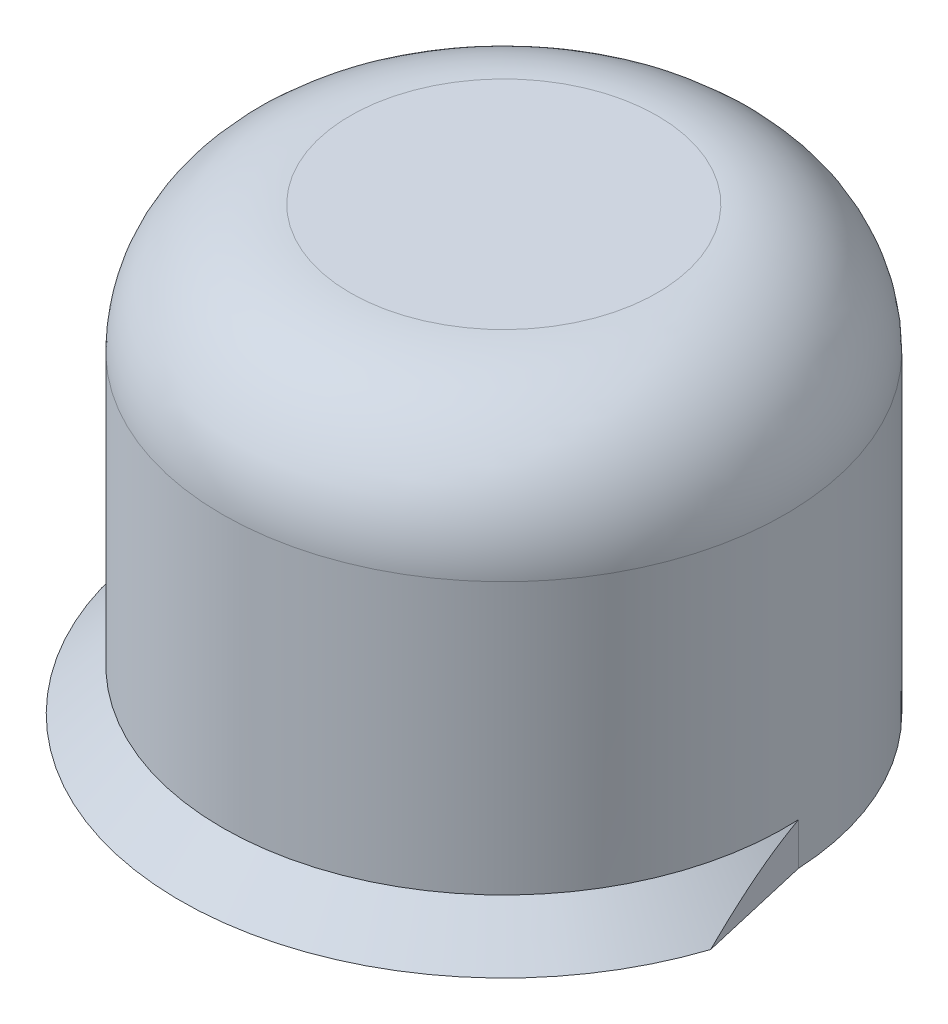
ISO-10303-21;
HEADER;
FILE_DESCRIPTION(('STEP AP214'),'2;1');
FILE_NAME('part.step','',(''),(''),'','','');
FILE_SCHEMA(('AUTOMOTIVE_DESIGN { 1 0 10303 214 1 1 1 1 }'));
ENDSEC;
DATA;
#1=APPLICATION_CONTEXT('core data for automotive mechanical design processes');
#2=APPLICATION_PROTOCOL_DEFINITION('international standard','automotive_design',2000,#1);
#3=PRODUCT_CONTEXT('',#1,'mechanical');
#4=PRODUCT('Part','Part','',(#3));
#5=PRODUCT_RELATED_PRODUCT_CATEGORY('part','',(#4));
#6=PRODUCT_DEFINITION_FORMATION('','',#4);
#7=PRODUCT_DEFINITION_CONTEXT('part definition',#1,'design');
#8=PRODUCT_DEFINITION('design','',#6,#7);
#9=PRODUCT_DEFINITION_SHAPE('','',#8);
#10=(LENGTH_UNIT() NAMED_UNIT(*) SI_UNIT(.MILLI.,.METRE.));
#11=(NAMED_UNIT(*) PLANE_ANGLE_UNIT() SI_UNIT($,.RADIAN.));
#12=(NAMED_UNIT(*) SI_UNIT($,.STERADIAN.) SOLID_ANGLE_UNIT());
#13=UNCERTAINTY_MEASURE_WITH_UNIT(LENGTH_MEASURE(1.E-05),#10,'distance_accuracy_value','');
#14=(GEOMETRIC_REPRESENTATION_CONTEXT(3) GLOBAL_UNCERTAINTY_ASSIGNED_CONTEXT((#13)) GLOBAL_UNIT_ASSIGNED_CONTEXT((#10,
#11,#12)) REPRESENTATION_CONTEXT('',''));
#15=CARTESIAN_POINT('',(0.,0.,0.));
#16=DIRECTION('',(0.,0.,1.));
#17=DIRECTION('',(1.,0.,0.));
#18=AXIS2_PLACEMENT_3D('',#15,#16,#17);
#19=CARTESIAN_POINT('',(0.,5.99999999999999,-0.100000000000007));
#20=DIRECTION('',(0.,1.,0.));
#21=DIRECTION('',(0.,0.,1.));
#22=AXIS2_PLACEMENT_3D('',#19,#20,#21);
#23=PLANE('',#22);
#24=CARTESIAN_POINT('',(0.,5.99999999999999,0.));
#25=DIRECTION('',(0.,1.,0.));
#26=DIRECTION('',(0.,0.,1.));
#27=AXIS2_PLACEMENT_3D('',#24,#25,#26);
#28=CIRCLE('',#27,1.37970522345143);
#29=CARTESIAN_POINT('',(0.,5.99999999999999,1.37970522345142));
#30=VERTEX_POINT('',#29);
#31=EDGE_CURVE('E11',#30,#30,#28,.T.);
#32=ORIENTED_EDGE('',*,*,#31,.F.);
#33=EDGE_LOOP('',(#32));
#34=FACE_BOUND('',#33,.T.);
#35=ADVANCED_FACE('F33',(#34),#23,.F.);
#36=CARTESIAN_POINT('',(0.,5.70000000000005,0.));
#37=DIRECTION('',(0.,1.,0.));
#38=DIRECTION('',(0.,0.,1.));
#39=AXIS2_PLACEMENT_3D('',#36,#37,#38);
#40=TOROIDAL_SURFACE('',#39,1.37970522345143,0.299999999999933);
#41=CARTESIAN_POINT('',(0.,5.70714083338395,0.));
#42=DIRECTION('',(0.,1.,0.));
#43=DIRECTION('',(0.,0.,1.));
#44=AXIS2_PLACEMENT_3D('',#41,#42,#43);
#45=CIRCLE('',#44,1.6796202255746);
#46=CARTESIAN_POINT('',(0.,5.70714083338395,1.67962022557459));
#47=VERTEX_POINT('',#46);
#48=EDGE_CURVE('E40',#47,#47,#45,.T.);
#49=ORIENTED_EDGE('',*,*,#48,.F.);
#50=EDGE_LOOP('',(#49));
#51=FACE_BOUND('',#50,.T.);
#52=ORIENTED_EDGE('',*,*,#31,.T.);
#53=EDGE_LOOP('',(#52));
#54=FACE_BOUND('',#53,.T.);
#55=ADVANCED_FACE('F99',(#51,#54),#40,.F.);
#56=CARTESIAN_POINT('',(0.,5.70714083338395,0.));
#57=DIRECTION('',(0.,-1.,0.));
#58=DIRECTION('',(0.,0.,-1.));
#59=AXIS2_PLACEMENT_3D('',#56,#57,#58);
#60=CONICAL_SURFACE('',#59,1.6796202255746,0.0238050261850818);
#61=CARTESIAN_POINT('',(0.,0.0999999999999742,0.));
#62=DIRECTION('',(0.,1.,0.));
#63=DIRECTION('',(0.,0.,1.));
#64=AXIS2_PLACEMENT_3D('',#61,#62,#63);
#65=CIRCLE('',#64,1.81312357875048);
#66=CARTESIAN_POINT('',(0.,0.099999999999976,1.81312357875048));
#67=VERTEX_POINT('',#66);
#68=EDGE_CURVE('E87',#67,#67,#65,.T.);
#69=ORIENTED_EDGE('',*,*,#68,.F.);
#70=EDGE_LOOP('',(#69));
#71=FACE_BOUND('',#70,.T.);
#72=ORIENTED_EDGE('',*,*,#48,.T.);
#73=EDGE_LOOP('',(#72));
#74=FACE_BOUND('',#73,.T.);
#75=ADVANCED_FACE('F97',(#71,#74),#60,.F.);
#76=CARTESIAN_POINT('',(0.,0.0999999999999739,-1.81312357875048));
#77=DIRECTION('',(0.,1.,0.));
#78=DIRECTION('',(0.,0.,1.));
#79=AXIS2_PLACEMENT_3D('',#76,#77,#78);
#80=PLANE('',#79);
#81=CARTESIAN_POINT('',(0.,0.0999999999999777,0.));
#82=DIRECTION('',(0.,1.,0.));
#83=DIRECTION('',(0.,0.,1.));
#84=AXIS2_PLACEMENT_3D('',#81,#82,#83);
#85=CIRCLE('',#84,5.0585786437627);
#86=CARTESIAN_POINT('',(-0.136005239791125,0.0999999999999727,-5.05674999084209));
#87=VERTEX_POINT('',#86);
#88=CARTESIAN_POINT('',(4.80773868635134,0.0999999999999772,1.57317088038547));
#89=VERTEX_POINT('',#88);
#90=EDGE_CURVE('E78',#87,#89,#85,.T.);
#91=ORIENTED_EDGE('',*,*,#90,.F.);
#92=CARTESIAN_POINT('',(2.4222510888865,0.0999999999999683,-7.41592877948463));
#93=DIRECTION('',(0.,-1.,0.));
#94=DIRECTION('',(0.,0.,-1.));
#95=AXIS2_PLACEMENT_3D('',#92,#93,#94);
#96=CIRCLE('',#95,3.48);
#97=CARTESIAN_POINT('',(0.831709132625496,0.0999999999999714,-4.32067817809975));
#98=VERTEX_POINT('',#97);
#99=EDGE_CURVE('E65',#98,#87,#96,.T.);
#100=ORIENTED_EDGE('',*,*,#99,.F.);
#101=CARTESIAN_POINT('',(0.,0.0999999999999757,0.));
#102=DIRECTION('',(0.,1.,0.));
#103=DIRECTION('',(0.,0.,-1.));
#104=AXIS2_PLACEMENT_3D('',#101,#102,#103);
#105=CIRCLE('',#104,4.4);
#106=CARTESIAN_POINT('',(4.39482180577916,0.0999999999999754,-0.213404066146471));
#107=VERTEX_POINT('',#106);
#108=EDGE_CURVE('E72',#107,#98,#105,.T.);
#109=ORIENTED_EDGE('',*,*,#108,.F.);
#110=DIRECTION('',(-0.225185878970765,0.,-0.974315821441982));
#111=VECTOR('',#110,1.);
#112=CARTESIAN_POINT('',(4.85019335720736,0.0999999999999774,1.75686027377992));
#113=LINE('',#112,#111);
#114=EDGE_CURVE('E81',#89,#107,#113,.T.);
#115=ORIENTED_EDGE('',*,*,#114,.F.);
#116=EDGE_LOOP('',(#91,#100,#109,#115));
#117=FACE_BOUND('',#116,.T.);
#118=ORIENTED_EDGE('',*,*,#68,.T.);
#119=EDGE_LOOP('',(#118));
#120=FACE_BOUND('',#119,.T.);
#121=ADVANCED_FACE('F85',(#117,#120),#80,.F.);
#122=CARTESIAN_POINT('',(0.,0.0999999999999777,0.));
#123=DIRECTION('',(0.,-1.,0.));
#124=DIRECTION('',(0.,0.,-1.));
#125=AXIS2_PLACEMENT_3D('',#122,#123,#124);
#126=CONICAL_SURFACE('',#125,5.0585786437627,0.785398163397435);
#127=CARTESIAN_POINT('',(0.,0.758578643762699,0.));
#128=DIRECTION('',(0.,1.,0.));
#129=DIRECTION('',(0.,0.,1.));
#130=AXIS2_PLACEMENT_3D('',#127,#128,#129);
#131=CIRCLE('',#130,4.4);
#132=CARTESIAN_POINT('',(0.831709132625527,0.758578643762694,-4.32067817809974));
#133=VERTEX_POINT('',#132);
#134=CARTESIAN_POINT('',(4.39482180577916,0.758578643762703,-0.213404066146472));
#135=VERTEX_POINT('',#134);
#136=EDGE_CURVE('E80',#133,#135,#131,.T.);
#137=ORIENTED_EDGE('',*,*,#136,.F.);
#138=CARTESIAN_POINT('',(-0.136185261347337,0.0997999999999824,-5.05694521832907));
#139=CARTESIAN_POINT('',(-0.0919146507666864,0.148951296288338,-5.00894848332219));
#140=CARTESIAN_POINT('',(-0.0457287926518286,0.19704424501389,-4.96155305842918));
#141=CARTESIAN_POINT('',(0.0509079403204471,0.290508909793079,-4.86804972847154));
#142=CARTESIAN_POINT('',(0.10137073613858,0.335872374200027,-4.82194593269776));
#143=CARTESIAN_POINT('',(0.20556920631068,0.422010286920572,-4.732399745031));
#144=CARTESIAN_POINT('',(0.25920682805691,0.462864498846416,-4.68892093377245));
#145=CARTESIAN_POINT('',(0.370935922358233,0.540117785771281,-4.60391373074353));
#146=CARTESIAN_POINT('',(0.429021545182183,0.576522554123314,-4.56238288927931));
#147=CARTESIAN_POINT('',(0.54263328651732,0.639731797467742,-4.48650560424714));
#148=CARTESIAN_POINT('',(0.597628901655045,0.667164170374998,-4.45189537346427));
#149=CARTESIAN_POINT('',(0.711761091293095,0.717029674357459,-4.38458209886032));
#150=CARTESIAN_POINT('',(0.770932684097088,0.739411685718069,-4.35190083265491));
#151=CARTESIAN_POINT('',(0.831909132625496,0.758641745793232,-4.32057541320221));
#152=B_SPLINE_CURVE_WITH_KNOTS('',3,(#138,#139,#140,#141,#142,#143,#144,#145,#146,#147,#148,
#149,#150,#151),.UNSPECIFIED.,.F.,.F.,(4,2,2,2,2,2,4),(0.,0.245223860030178,0.491155240125193,
0.731603562779867,0.971740921458032,1.18303626077972,1.39638292032856),.UNSPECIFIED.);
#153=EDGE_CURVE('E47',#87,#133,#152,.T.);
#154=ORIENTED_EDGE('',*,*,#153,.F.);
#155=ORIENTED_EDGE('',*,*,#90,.T.);
#156=CARTESIAN_POINT('',(4.09985341597019,0.796485958316,-1.48964914123599));
#157=CARTESIAN_POINT('',(4.12418697329778,0.809626528282493,-1.38436469798139));
#158=CARTESIAN_POINT('',(4.14863198809412,0.818759750888669,-1.27859800967786));
#159=CARTESIAN_POINT('',(4.19759438541867,0.828901649096701,-1.06675151829451));
#160=CARTESIAN_POINT('',(4.22211172378026,0.829914540806912,-0.960671906311178));
#161=CARTESIAN_POINT('',(4.27073582602457,0.823765061489089,-0.750289122379136));
#162=CARTESIAN_POINT('',(4.29484335341049,0.816721960440702,-0.645982646967363));
#163=CARTESIAN_POINT('',(4.3428809564671,0.794942940052181,-0.43813747969433));
#164=CARTESIAN_POINT('',(4.36681100943371,0.780206053103022,-0.334598886067237));
#165=CARTESIAN_POINT('',(4.42738368743716,0.733520010225156,-0.0725179829679252));
#166=CARTESIAN_POINT('',(4.46383316269196,0.696566233664158,0.0851886218437481));
#167=CARTESIAN_POINT('',(4.53582374902999,0.608043484444325,0.396671595752305));
#168=CARTESIAN_POINT('',(4.57136419511454,0.556464128054968,0.550445087587372));
#169=CARTESIAN_POINT('',(4.64182281020668,0.440879293426889,0.855299653757023));
#170=CARTESIAN_POINT('',(4.67673029986942,0.376747154802436,1.00633452157678));
#171=CARTESIAN_POINT('',(4.74556036402735,0.238973803957787,1.30414280692066));
#172=CARTESIAN_POINT('',(4.77948312753937,0.165334431619864,1.4509170422673));
#173=CARTESIAN_POINT('',(4.84203681576209,0.0207798390233217,1.72156921816534));
#174=CARTESIAN_POINT('',(4.87077640571576,-0.0492174192430789,1.84591732259178));
#175=CARTESIAN_POINT('',(4.92766494876189,-0.193791140035946,2.09205801223877));
#176=CARTESIAN_POINT('',(4.95581387409955,-0.268367817101565,2.21385047737212));
#177=CARTESIAN_POINT('',(5.01107887458886,-0.419843119143211,2.45296655603052));
#178=CARTESIAN_POINT('',(5.03820442415549,-0.496673949508001,2.57033116267848));
#179=CARTESIAN_POINT('',(5.09200365395751,-0.653292842335611,2.80310526475396));
#180=CARTESIAN_POINT('',(5.11867751796487,-0.733079657855264,2.918515555311));
#181=CARTESIAN_POINT('',(5.14516174701633,-0.81406042622144,3.03310534886944));
#182=B_SPLINE_CURVE_WITH_KNOTS('',3,(#156,#157,#158,#159,#160,#161,#162,#163,#164,#165,#166,
#167,#168,#169,#170,#171,#172,#173,#174,#175,#176,#177,#178,#179,#180,#181),.UNSPECIFIED.,.F.,
.F.,(4,2,2,2,2,2,2,2,2,2,2,2,4),(0.,0.326505630822393,0.652841727626361,0.974408227406926,
1.29601517874574,1.79322629487857,2.29079130392686,2.79366295568872,3.29643743495415,
3.73301262063007,4.16960827484995,4.59818590841228,5.02658476590047),.UNSPECIFIED.);
#183=EDGE_CURVE('E82',#135,#89,#182,.T.);
#184=ORIENTED_EDGE('',*,*,#183,.F.);
#185=EDGE_LOOP('',(#137,#154,#155,#184));
#186=FACE_BOUND('',#185,.T.);
#187=ADVANCED_FACE('F77',(#186),#126,.T.);
#188=CARTESIAN_POINT('',(0.,6.99999999999999,0.));
#189=DIRECTION('',(0.,1.,0.));
#190=DIRECTION('',(0.,0.,1.));
#191=AXIS2_PLACEMENT_3D('',#188,#189,#190);
#192=CYLINDRICAL_SURFACE('',#191,4.4);
#193=CARTESIAN_POINT('',(0.,4.99999999999999,0.));
#194=DIRECTION('',(0.,1.,0.));
#195=DIRECTION('',(0.,0.,1.));
#196=AXIS2_PLACEMENT_3D('',#193,#194,#195);
#197=CIRCLE('',#196,4.4);
#198=CARTESIAN_POINT('',(0.,5.,4.39999999999999));
#199=VERTEX_POINT('',#198);
#200=EDGE_CURVE('E91',#199,#199,#197,.T.);
#201=ORIENTED_EDGE('',*,*,#200,.F.);
#202=EDGE_LOOP('',(#201));
#203=FACE_BOUND('',#202,.T.);
#204=ORIENTED_EDGE('',*,*,#136,.T.);
#205=DIRECTION('',(0.,-1.,0.));
#206=VECTOR('',#205,1.);
#207=CARTESIAN_POINT('',(4.39482180577916,7.001,-0.213404066146478));
#208=LINE('',#207,#206);
#209=EDGE_CURVE('E55',#135,#107,#208,.T.);
#210=ORIENTED_EDGE('',*,*,#209,.T.);
#211=ORIENTED_EDGE('',*,*,#108,.T.);
#212=DIRECTION('',(0.,-1.,0.));
#213=VECTOR('',#212,1.);
#214=CARTESIAN_POINT('',(0.831709132625496,7.001,-4.32067817809976));
#215=LINE('',#214,#213);
#216=EDGE_CURVE('E67',#133,#98,#215,.T.);
#217=ORIENTED_EDGE('',*,*,#216,.F.);
#218=EDGE_LOOP('',(#204,#210,#211,#217));
#219=FACE_BOUND('',#218,.T.);
#220=ADVANCED_FACE('F132',(#203,#219),#192,.T.);
#221=CARTESIAN_POINT('',(0.,4.99999999999999,0.));
#222=DIRECTION('',(0.,1.,0.));
#223=DIRECTION('',(0.,0.,1.));
#224=AXIS2_PLACEMENT_3D('',#221,#222,#223);
#225=TOROIDAL_SURFACE('',#224,2.4,2.);
#226=CARTESIAN_POINT('',(0.,6.99999999999999,0.));
#227=DIRECTION('',(0.,1.,0.));
#228=DIRECTION('',(0.,0.,1.));
#229=AXIS2_PLACEMENT_3D('',#226,#227,#228);
#230=CIRCLE('',#229,2.4);
#231=CARTESIAN_POINT('',(0.,6.99999999999999,2.39999999999999));
#232=VERTEX_POINT('',#231);
#233=EDGE_CURVE('E211',#232,#232,#230,.T.);
#234=ORIENTED_EDGE('',*,*,#233,.F.);
#235=EDGE_LOOP('',(#234));
#236=FACE_BOUND('',#235,.T.);
#237=ORIENTED_EDGE('',*,*,#200,.T.);
#238=EDGE_LOOP('',(#237));
#239=FACE_BOUND('',#238,.T.);
#240=ADVANCED_FACE('F139',(#236,#239),#225,.T.);
#241=CARTESIAN_POINT('',(0.,6.99999999999999,-2.4));
#242=DIRECTION('',(0.,-1.,0.));
#243=DIRECTION('',(0.,0.,-1.));
#244=AXIS2_PLACEMENT_3D('',#241,#242,#243);
#245=PLANE('',#244);
#246=ORIENTED_EDGE('',*,*,#233,.T.);
#247=EDGE_LOOP('',(#246));
#248=FACE_BOUND('',#247,.T.);
#249=ADVANCED_FACE('F147',(#248),#245,.F.);
#250=CARTESIAN_POINT('',(2.4222510888865,7.00099999999999,-7.41592877948464));
#251=DIRECTION('',(0.,-1.,0.));
#252=DIRECTION('',(0.,0.,-1.));
#253=AXIS2_PLACEMENT_3D('',#250,#251,#252);
#254=CYLINDRICAL_SURFACE('',#253,3.48);
#255=ORIENTED_EDGE('',*,*,#153,.T.);
#256=ORIENTED_EDGE('',*,*,#216,.T.);
#257=ORIENTED_EDGE('',*,*,#99,.T.);
#258=EDGE_LOOP('',(#255,#256,#257));
#259=FACE_BOUND('',#258,.T.);
#260=ADVANCED_FACE('F66',(#259),#254,.F.);
#261=CARTESIAN_POINT('',(4.85019335720736,7.001,1.75686027377992));
#262=DIRECTION('',(-0.974315821441982,0.,0.225185878970765));
#263=DIRECTION('',(0.225185878970765,0.,0.974315821441982));
#264=AXIS2_PLACEMENT_3D('',#261,#262,#263);
#265=PLANE('',#264);
#266=ORIENTED_EDGE('',*,*,#183,.T.);
#267=ORIENTED_EDGE('',*,*,#114,.T.);
#268=ORIENTED_EDGE('',*,*,#209,.F.);
#269=EDGE_LOOP('',(#266,#267,#268));
#270=FACE_BOUND('',#269,.T.);
#271=ADVANCED_FACE('F160',(#270),#265,.F.);
#272=CLOSED_SHELL('',(#35,#55,#75,#121,#187,#220,#240,#249,#260,#271));
#273=MANIFOLD_SOLID_BREP('B2',#272);
#274=ADVANCED_BREP_SHAPE_REPRESENTATION('',(#18,#273),#14);
#275=SHAPE_DEFINITION_REPRESENTATION(#9,#274);
ENDSEC;
END-ISO-10303-21;
